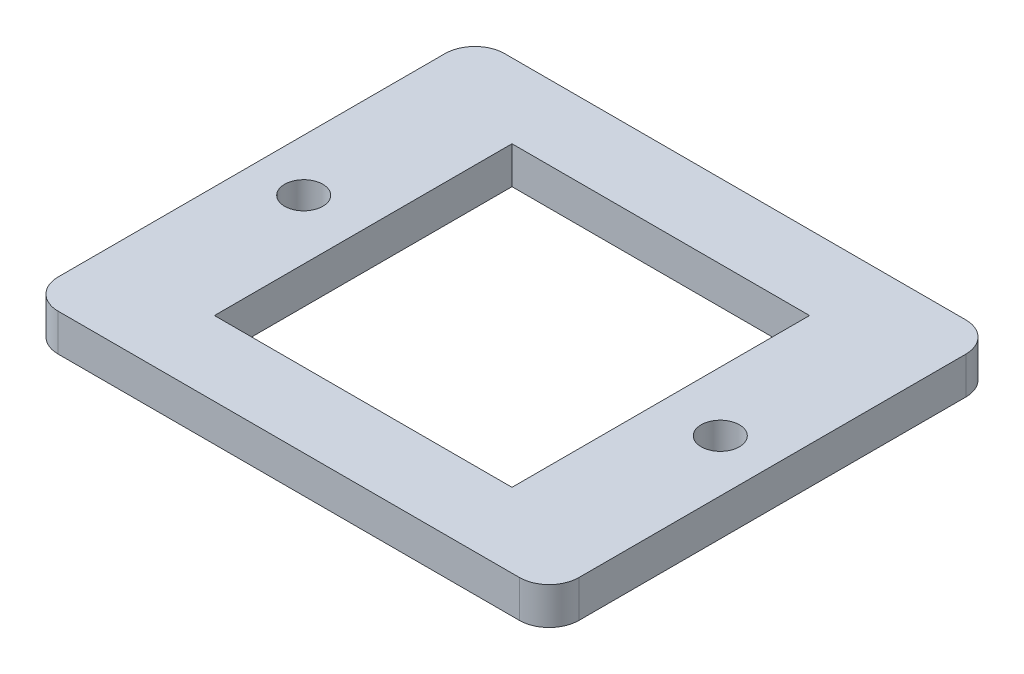
ISO-10303-21;
HEADER;
FILE_DESCRIPTION(('STEP AP214'),'2;1');
FILE_NAME('part.step','',(''),(''),'','','');
FILE_SCHEMA(('AUTOMOTIVE_DESIGN { 1 0 10303 214 1 1 1 1 }'));
ENDSEC;
DATA;
#1=APPLICATION_CONTEXT('core data for automotive mechanical design processes');
#2=APPLICATION_PROTOCOL_DEFINITION('international standard','automotive_design',2000,#1);
#3=PRODUCT_CONTEXT('',#1,'mechanical');
#4=PRODUCT('Part','Part','',(#3));
#5=PRODUCT_RELATED_PRODUCT_CATEGORY('part','',(#4));
#6=PRODUCT_DEFINITION_FORMATION('','',#4);
#7=PRODUCT_DEFINITION_CONTEXT('part definition',#1,'design');
#8=PRODUCT_DEFINITION('design','',#6,#7);
#9=PRODUCT_DEFINITION_SHAPE('','',#8);
#10=(LENGTH_UNIT() NAMED_UNIT(*) SI_UNIT(.MILLI.,.METRE.));
#11=(NAMED_UNIT(*) PLANE_ANGLE_UNIT() SI_UNIT($,.RADIAN.));
#12=(NAMED_UNIT(*) SI_UNIT($,.STERADIAN.) SOLID_ANGLE_UNIT());
#13=UNCERTAINTY_MEASURE_WITH_UNIT(LENGTH_MEASURE(1.E-05),#10,'distance_accuracy_value','');
#14=(GEOMETRIC_REPRESENTATION_CONTEXT(3) GLOBAL_UNCERTAINTY_ASSIGNED_CONTEXT((#13)) GLOBAL_UNIT_ASSIGNED_CONTEXT((#10,
#11,#12)) REPRESENTATION_CONTEXT('',''));
#15=CARTESIAN_POINT('',(0.,0.,0.));
#16=DIRECTION('',(0.,0.,1.));
#17=DIRECTION('',(1.,0.,0.));
#18=AXIS2_PLACEMENT_3D('',#15,#16,#17);
#19=CARTESIAN_POINT('',(22.225,3.175,-19.05));
#20=DIRECTION('',(-1.,0.,0.));
#21=DIRECTION('',(0.,0.,1.));
#22=AXIS2_PLACEMENT_3D('',#19,#20,#21);
#23=PLANE('',#22);
#24=DIRECTION('',(0.,0.,-1.));
#25=VECTOR('',#24,1.);
#26=CARTESIAN_POINT('',(22.225,3.175,-19.05));
#27=LINE('',#26,#25);
#28=CARTESIAN_POINT('',(22.225,3.175,16.51));
#29=VERTEX_POINT('',#28);
#30=CARTESIAN_POINT('',(22.225,3.175,-16.51));
#31=VERTEX_POINT('',#30);
#32=EDGE_CURVE('E171',#29,#31,#27,.T.);
#33=ORIENTED_EDGE('',*,*,#32,.F.);
#34=DIRECTION('',(0.,-1.,0.));
#35=VECTOR('',#34,1.);
#36=CARTESIAN_POINT('',(22.225,3.175,16.51));
#37=LINE('',#36,#35);
#38=CARTESIAN_POINT('',(22.225,0.,16.51));
#39=VERTEX_POINT('',#38);
#40=EDGE_CURVE('E199',#29,#39,#37,.T.);
#41=ORIENTED_EDGE('',*,*,#40,.T.);
#42=DIRECTION('',(0.,0.,-1.));
#43=VECTOR('',#42,1.);
#44=CARTESIAN_POINT('',(22.225,0.,-19.05));
#45=LINE('',#44,#43);
#46=CARTESIAN_POINT('',(22.225,0.,-16.51));
#47=VERTEX_POINT('',#46);
#48=EDGE_CURVE('E167',#39,#47,#45,.T.);
#49=ORIENTED_EDGE('',*,*,#48,.T.);
#50=DIRECTION('',(0.,-1.,0.));
#51=VECTOR('',#50,1.);
#52=CARTESIAN_POINT('',(22.225,3.175,-16.51));
#53=LINE('',#52,#51);
#54=EDGE_CURVE('E182',#47,#31,#53,.F.);
#55=ORIENTED_EDGE('',*,*,#54,.T.);
#56=EDGE_LOOP('',(#33,#41,#49,#55));
#57=FACE_BOUND('',#56,.T.);
#58=ADVANCED_FACE('F33',(#57),#23,.F.);
#59=CARTESIAN_POINT('',(-22.225,3.175,-19.05));
#60=DIRECTION('',(0.,0.,1.));
#61=DIRECTION('',(1.,0.,0.));
#62=AXIS2_PLACEMENT_3D('',#59,#60,#61);
#63=PLANE('',#62);
#64=DIRECTION('',(-1.,0.,0.));
#65=VECTOR('',#64,1.);
#66=CARTESIAN_POINT('',(-22.225,3.175,-19.05));
#67=LINE('',#66,#65);
#68=CARTESIAN_POINT('',(19.685,3.175,-19.05));
#69=VERTEX_POINT('',#68);
#70=CARTESIAN_POINT('',(-19.685,3.175,-19.05));
#71=VERTEX_POINT('',#70);
#72=EDGE_CURVE('E174',#69,#71,#67,.T.);
#73=ORIENTED_EDGE('',*,*,#72,.F.);
#74=DIRECTION('',(0.,-1.,0.));
#75=VECTOR('',#74,1.);
#76=CARTESIAN_POINT('',(19.685,3.175,-19.05));
#77=LINE('',#76,#75);
#78=CARTESIAN_POINT('',(19.685,0.,-19.05));
#79=VERTEX_POINT('',#78);
#80=EDGE_CURVE('E224',#69,#79,#77,.T.);
#81=ORIENTED_EDGE('',*,*,#80,.T.);
#82=DIRECTION('',(-1.,0.,0.));
#83=VECTOR('',#82,1.);
#84=CARTESIAN_POINT('',(-22.225,0.,-19.05));
#85=LINE('',#84,#83);
#86=CARTESIAN_POINT('',(-19.685,0.,-19.05));
#87=VERTEX_POINT('',#86);
#88=EDGE_CURVE('E185',#79,#87,#85,.T.);
#89=ORIENTED_EDGE('',*,*,#88,.T.);
#90=DIRECTION('',(0.,-1.,0.));
#91=VECTOR('',#90,1.);
#92=CARTESIAN_POINT('',(-19.685,3.175,-19.05));
#93=LINE('',#92,#91);
#94=EDGE_CURVE('E222',#87,#71,#93,.F.);
#95=ORIENTED_EDGE('',*,*,#94,.T.);
#96=EDGE_LOOP('',(#73,#81,#89,#95));
#97=FACE_BOUND('',#96,.T.);
#98=ADVANCED_FACE('F230',(#97),#63,.F.);
#99=CARTESIAN_POINT('',(-22.225,3.175,-19.05));
#100=DIRECTION('',(1.,0.,0.));
#101=DIRECTION('',(0.,0.,-1.));
#102=AXIS2_PLACEMENT_3D('',#99,#100,#101);
#103=PLANE('',#102);
#104=DIRECTION('',(0.,0.,1.));
#105=VECTOR('',#104,1.);
#106=CARTESIAN_POINT('',(-22.225,3.175,-19.05));
#107=LINE('',#106,#105);
#108=CARTESIAN_POINT('',(-22.225,3.175,-16.51));
#109=VERTEX_POINT('',#108);
#110=CARTESIAN_POINT('',(-22.225,3.175,16.51));
#111=VERTEX_POINT('',#110);
#112=EDGE_CURVE('E177',#109,#111,#107,.T.);
#113=ORIENTED_EDGE('',*,*,#112,.F.);
#114=DIRECTION('',(0.,-1.,0.));
#115=VECTOR('',#114,1.);
#116=CARTESIAN_POINT('',(-22.225,3.175,-16.51));
#117=LINE('',#116,#115);
#118=CARTESIAN_POINT('',(-22.225,0.,-16.51));
#119=VERTEX_POINT('',#118);
#120=EDGE_CURVE('E11',#109,#119,#117,.T.);
#121=ORIENTED_EDGE('',*,*,#120,.T.);
#122=DIRECTION('',(0.,0.,1.));
#123=VECTOR('',#122,1.);
#124=CARTESIAN_POINT('',(-22.225,0.,-19.05));
#125=LINE('',#124,#123);
#126=CARTESIAN_POINT('',(-22.225,0.,16.51));
#127=VERTEX_POINT('',#126);
#128=EDGE_CURVE('E188',#119,#127,#125,.T.);
#129=ORIENTED_EDGE('',*,*,#128,.T.);
#130=DIRECTION('',(0.,-1.,0.));
#131=VECTOR('',#130,1.);
#132=CARTESIAN_POINT('',(-22.225,3.175,16.51));
#133=LINE('',#132,#131);
#134=EDGE_CURVE('E41',#127,#111,#133,.F.);
#135=ORIENTED_EDGE('',*,*,#134,.T.);
#136=EDGE_LOOP('',(#113,#121,#129,#135));
#137=FACE_BOUND('',#136,.T.);
#138=ADVANCED_FACE('F239',(#137),#103,.F.);
#139=CARTESIAN_POINT('',(-22.225,3.175,19.05));
#140=DIRECTION('',(0.,0.,-1.));
#141=DIRECTION('',(-1.,0.,0.));
#142=AXIS2_PLACEMENT_3D('',#139,#140,#141);
#143=PLANE('',#142);
#144=DIRECTION('',(1.,0.,0.));
#145=VECTOR('',#144,1.);
#146=CARTESIAN_POINT('',(-22.225,0.,19.05));
#147=LINE('',#146,#145);
#148=CARTESIAN_POINT('',(-19.685,0.,19.05));
#149=VERTEX_POINT('',#148);
#150=CARTESIAN_POINT('',(19.685,0.,19.05));
#151=VERTEX_POINT('',#150);
#152=EDGE_CURVE('E175',#149,#151,#147,.T.);
#153=ORIENTED_EDGE('',*,*,#152,.T.);
#154=DIRECTION('',(0.,-1.,0.));
#155=VECTOR('',#154,1.);
#156=CARTESIAN_POINT('',(19.685,3.175,19.05));
#157=LINE('',#156,#155);
#158=CARTESIAN_POINT('',(19.685,3.175,19.05));
#159=VERTEX_POINT('',#158);
#160=EDGE_CURVE('E213',#151,#159,#157,.F.);
#161=ORIENTED_EDGE('',*,*,#160,.T.);
#162=DIRECTION('',(1.,0.,0.));
#163=VECTOR('',#162,1.);
#164=CARTESIAN_POINT('',(-22.225,3.175,19.05));
#165=LINE('',#164,#163);
#166=CARTESIAN_POINT('',(-19.685,3.175,19.05));
#167=VERTEX_POINT('',#166);
#168=EDGE_CURVE('E179',#167,#159,#165,.T.);
#169=ORIENTED_EDGE('',*,*,#168,.F.);
#170=DIRECTION('',(0.,-1.,0.));
#171=VECTOR('',#170,1.);
#172=CARTESIAN_POINT('',(-19.685,3.175,19.05));
#173=LINE('',#172,#171);
#174=EDGE_CURVE('E210',#167,#149,#173,.T.);
#175=ORIENTED_EDGE('',*,*,#174,.T.);
#176=EDGE_LOOP('',(#153,#161,#169,#175));
#177=FACE_BOUND('',#176,.T.);
#178=ADVANCED_FACE('F247',(#177),#143,.F.);
#179=CARTESIAN_POINT('',(0.,3.175,0.));
#180=DIRECTION('',(0.,1.,0.));
#181=DIRECTION('',(0.,0.,1.));
#182=AXIS2_PLACEMENT_3D('',#179,#180,#181);
#183=PLANE('',#182);
#184=CARTESIAN_POINT('',(-17.78,3.175,0.));
#185=DIRECTION('',(0.,1.,0.));
#186=DIRECTION('',(0.,0.,1.));
#187=AXIS2_PLACEMENT_3D('',#184,#185,#186);
#188=CIRCLE('',#187,1.63194999999999);
#189=CARTESIAN_POINT('',(-17.78,3.175,1.63194999999999));
#190=VERTEX_POINT('',#189);
#191=EDGE_CURVE('E197',#190,#190,#188,.T.);
#192=ORIENTED_EDGE('',*,*,#191,.F.);
#193=EDGE_LOOP('',(#192));
#194=FACE_BOUND('',#193,.T.);
#195=CARTESIAN_POINT('',(17.78,3.175,0.));
#196=DIRECTION('',(0.,1.,0.));
#197=DIRECTION('',(0.,0.,1.));
#198=AXIS2_PLACEMENT_3D('',#195,#196,#197);
#199=CIRCLE('',#198,1.63194999999999);
#200=CARTESIAN_POINT('',(17.78,3.175,1.63194999999999));
#201=VERTEX_POINT('',#200);
#202=EDGE_CURVE('E154',#201,#201,#199,.T.);
#203=ORIENTED_EDGE('',*,*,#202,.F.);
#204=EDGE_LOOP('',(#203));
#205=FACE_BOUND('',#204,.T.);
#206=DIRECTION('',(0.,0.,-1.));
#207=VECTOR('',#206,1.);
#208=CARTESIAN_POINT('',(12.7,3.175,-12.7));
#209=LINE('',#208,#207);
#210=CARTESIAN_POINT('',(12.7,3.175,12.7));
#211=VERTEX_POINT('',#210);
#212=CARTESIAN_POINT('',(12.7,3.175,-12.7));
#213=VERTEX_POINT('',#212);
#214=EDGE_CURVE('E130',#211,#213,#209,.T.);
#215=ORIENTED_EDGE('',*,*,#214,.F.);
#216=DIRECTION('',(1.,0.,0.));
#217=VECTOR('',#216,1.);
#218=CARTESIAN_POINT('',(-12.7,3.175,12.7));
#219=LINE('',#218,#217);
#220=CARTESIAN_POINT('',(-12.7,3.175,12.7));
#221=VERTEX_POINT('',#220);
#222=EDGE_CURVE('E148',#221,#211,#219,.T.);
#223=ORIENTED_EDGE('',*,*,#222,.F.);
#224=DIRECTION('',(0.,0.,1.));
#225=VECTOR('',#224,1.);
#226=CARTESIAN_POINT('',(-12.7,3.175,-12.7));
#227=LINE('',#226,#225);
#228=CARTESIAN_POINT('',(-12.7,3.175,-12.7));
#229=VERTEX_POINT('',#228);
#230=EDGE_CURVE('E151',#229,#221,#227,.T.);
#231=ORIENTED_EDGE('',*,*,#230,.F.);
#232=DIRECTION('',(-1.,0.,0.));
#233=VECTOR('',#232,1.);
#234=CARTESIAN_POINT('',(-12.7,3.175,-12.7));
#235=LINE('',#234,#233);
#236=EDGE_CURVE('E160',#213,#229,#235,.T.);
#237=ORIENTED_EDGE('',*,*,#236,.F.);
#238=EDGE_LOOP('',(#215,#223,#231,#237));
#239=FACE_BOUND('',#238,.T.);
#240=ORIENTED_EDGE('',*,*,#168,.T.);
#241=CARTESIAN_POINT('',(19.685,3.175,16.51));
#242=DIRECTION('',(0.,1.,0.));
#243=DIRECTION('',(0.,0.,1.));
#244=AXIS2_PLACEMENT_3D('',#241,#242,#243);
#245=CIRCLE('',#244,2.54);
#246=EDGE_CURVE('E220',#159,#29,#245,.T.);
#247=ORIENTED_EDGE('',*,*,#246,.T.);
#248=ORIENTED_EDGE('',*,*,#32,.T.);
#249=CARTESIAN_POINT('',(19.685,3.175,-16.51));
#250=DIRECTION('',(0.,1.,0.));
#251=DIRECTION('',(0.,0.,1.));
#252=AXIS2_PLACEMENT_3D('',#249,#250,#251);
#253=CIRCLE('',#252,2.54);
#254=EDGE_CURVE('E218',#31,#69,#253,.T.);
#255=ORIENTED_EDGE('',*,*,#254,.T.);
#256=ORIENTED_EDGE('',*,*,#72,.T.);
#257=CARTESIAN_POINT('',(-19.685,3.175,-16.51));
#258=DIRECTION('',(0.,1.,0.));
#259=DIRECTION('',(0.,0.,1.));
#260=AXIS2_PLACEMENT_3D('',#257,#258,#259);
#261=CIRCLE('',#260,2.54);
#262=EDGE_CURVE('E54',#71,#109,#261,.T.);
#263=ORIENTED_EDGE('',*,*,#262,.T.);
#264=ORIENTED_EDGE('',*,*,#112,.T.);
#265=CARTESIAN_POINT('',(-19.685,3.175,16.51));
#266=DIRECTION('',(0.,1.,0.));
#267=DIRECTION('',(0.,0.,1.));
#268=AXIS2_PLACEMENT_3D('',#265,#266,#267);
#269=CIRCLE('',#268,2.54);
#270=EDGE_CURVE('E215',#111,#167,#269,.T.);
#271=ORIENTED_EDGE('',*,*,#270,.T.);
#272=EDGE_LOOP('',(#240,#247,#248,#255,#256,#263,#264,#271));
#273=FACE_BOUND('',#272,.T.);
#274=ADVANCED_FACE('F241',(#194,#205,#239,#273),#183,.T.);
#275=CARTESIAN_POINT('',(0.,0.,0.));
#276=DIRECTION('',(0.,1.,0.));
#277=DIRECTION('',(0.,0.,1.));
#278=AXIS2_PLACEMENT_3D('',#275,#276,#277);
#279=PLANE('',#278);
#280=CARTESIAN_POINT('',(-17.78,0.,0.));
#281=DIRECTION('',(0.,1.,0.));
#282=DIRECTION('',(0.,0.,1.));
#283=AXIS2_PLACEMENT_3D('',#280,#281,#282);
#284=CIRCLE('',#283,1.63194999999999);
#285=CARTESIAN_POINT('',(-17.78,0.,1.63194999999999));
#286=VERTEX_POINT('',#285);
#287=EDGE_CURVE('E194',#286,#286,#284,.T.);
#288=ORIENTED_EDGE('',*,*,#287,.T.);
#289=EDGE_LOOP('',(#288));
#290=FACE_BOUND('',#289,.T.);
#291=CARTESIAN_POINT('',(17.78,0.,0.));
#292=DIRECTION('',(0.,1.,0.));
#293=DIRECTION('',(0.,0.,1.));
#294=AXIS2_PLACEMENT_3D('',#291,#292,#293);
#295=CIRCLE('',#294,1.63194999999999);
#296=CARTESIAN_POINT('',(17.78,0.,1.63194999999999));
#297=VERTEX_POINT('',#296);
#298=EDGE_CURVE('E161',#297,#297,#295,.T.);
#299=ORIENTED_EDGE('',*,*,#298,.T.);
#300=EDGE_LOOP('',(#299));
#301=FACE_BOUND('',#300,.T.);
#302=DIRECTION('',(1.,0.,0.));
#303=VECTOR('',#302,1.);
#304=CARTESIAN_POINT('',(-12.7,0.,12.7));
#305=LINE('',#304,#303);
#306=CARTESIAN_POINT('',(-12.7,0.,12.7));
#307=VERTEX_POINT('',#306);
#308=CARTESIAN_POINT('',(12.7,0.,12.7));
#309=VERTEX_POINT('',#308);
#310=EDGE_CURVE('E135',#307,#309,#305,.T.);
#311=ORIENTED_EDGE('',*,*,#310,.T.);
#312=DIRECTION('',(0.,0.,-1.));
#313=VECTOR('',#312,1.);
#314=CARTESIAN_POINT('',(12.7,0.,-12.7));
#315=LINE('',#314,#313);
#316=CARTESIAN_POINT('',(12.7,0.,-12.7));
#317=VERTEX_POINT('',#316);
#318=EDGE_CURVE('E127',#309,#317,#315,.T.);
#319=ORIENTED_EDGE('',*,*,#318,.T.);
#320=DIRECTION('',(-1.,0.,0.));
#321=VECTOR('',#320,1.);
#322=CARTESIAN_POINT('',(-12.7,0.,-12.7));
#323=LINE('',#322,#321);
#324=CARTESIAN_POINT('',(-12.7,0.,-12.7));
#325=VERTEX_POINT('',#324);
#326=EDGE_CURVE('E139',#317,#325,#323,.T.);
#327=ORIENTED_EDGE('',*,*,#326,.T.);
#328=DIRECTION('',(0.,0.,1.));
#329=VECTOR('',#328,1.);
#330=CARTESIAN_POINT('',(-12.7,0.,-12.7));
#331=LINE('',#330,#329);
#332=EDGE_CURVE('E143',#325,#307,#331,.T.);
#333=ORIENTED_EDGE('',*,*,#332,.T.);
#334=EDGE_LOOP('',(#311,#319,#327,#333));
#335=FACE_BOUND('',#334,.T.);
#336=ORIENTED_EDGE('',*,*,#48,.F.);
#337=CARTESIAN_POINT('',(19.685,0.,16.51));
#338=DIRECTION('',(0.,1.,0.));
#339=DIRECTION('',(0.,0.,1.));
#340=AXIS2_PLACEMENT_3D('',#337,#338,#339);
#341=CIRCLE('',#340,2.54);
#342=EDGE_CURVE('E208',#39,#151,#341,.F.);
#343=ORIENTED_EDGE('',*,*,#342,.T.);
#344=ORIENTED_EDGE('',*,*,#152,.F.);
#345=CARTESIAN_POINT('',(-19.685,0.,16.51));
#346=DIRECTION('',(0.,1.,0.));
#347=DIRECTION('',(0.,0.,1.));
#348=AXIS2_PLACEMENT_3D('',#345,#346,#347);
#349=CIRCLE('',#348,2.54);
#350=EDGE_CURVE('E202',#149,#127,#349,.F.);
#351=ORIENTED_EDGE('',*,*,#350,.T.);
#352=ORIENTED_EDGE('',*,*,#128,.F.);
#353=CARTESIAN_POINT('',(-19.685,0.,-16.51));
#354=DIRECTION('',(0.,1.,0.));
#355=DIRECTION('',(0.,0.,1.));
#356=AXIS2_PLACEMENT_3D('',#353,#354,#355);
#357=CIRCLE('',#356,2.54);
#358=EDGE_CURVE('E204',#119,#87,#357,.F.);
#359=ORIENTED_EDGE('',*,*,#358,.T.);
#360=ORIENTED_EDGE('',*,*,#88,.F.);
#361=CARTESIAN_POINT('',(19.685,0.,-16.51));
#362=DIRECTION('',(0.,1.,0.));
#363=DIRECTION('',(0.,0.,1.));
#364=AXIS2_PLACEMENT_3D('',#361,#362,#363);
#365=CIRCLE('',#364,2.54);
#366=EDGE_CURVE('E206',#79,#47,#365,.F.);
#367=ORIENTED_EDGE('',*,*,#366,.T.);
#368=EDGE_LOOP('',(#336,#343,#344,#351,#352,#359,#360,#367));
#369=FACE_BOUND('',#368,.T.);
#370=ADVANCED_FACE('F145',(#290,#301,#335,#369),#279,.F.);
#371=CARTESIAN_POINT('',(12.7,0.,-12.7));
#372=DIRECTION('',(1.,0.,0.));
#373=DIRECTION('',(0.,0.,-1.));
#374=AXIS2_PLACEMENT_3D('',#371,#372,#373);
#375=PLANE('',#374);
#376=ORIENTED_EDGE('',*,*,#214,.T.);
#377=DIRECTION('',(0.,1.,0.));
#378=VECTOR('',#377,1.);
#379=CARTESIAN_POINT('',(12.7,0.,-12.7));
#380=LINE('',#379,#378);
#381=EDGE_CURVE('E123',#317,#213,#380,.T.);
#382=ORIENTED_EDGE('',*,*,#381,.F.);
#383=ORIENTED_EDGE('',*,*,#318,.F.);
#384=DIRECTION('',(0.,1.,0.));
#385=VECTOR('',#384,1.);
#386=CARTESIAN_POINT('',(12.7,0.,12.7));
#387=LINE('',#386,#385);
#388=EDGE_CURVE('E165',#309,#211,#387,.T.);
#389=ORIENTED_EDGE('',*,*,#388,.T.);
#390=EDGE_LOOP('',(#376,#382,#383,#389));
#391=FACE_BOUND('',#390,.T.);
#392=ADVANCED_FACE('F125',(#391),#375,.F.);
#393=CARTESIAN_POINT('',(-12.7,0.,12.7));
#394=DIRECTION('',(0.,0.,1.));
#395=DIRECTION('',(1.,0.,0.));
#396=AXIS2_PLACEMENT_3D('',#393,#394,#395);
#397=PLANE('',#396);
#398=ORIENTED_EDGE('',*,*,#222,.T.);
#399=ORIENTED_EDGE('',*,*,#388,.F.);
#400=ORIENTED_EDGE('',*,*,#310,.F.);
#401=DIRECTION('',(0.,1.,0.));
#402=VECTOR('',#401,1.);
#403=CARTESIAN_POINT('',(-12.7,0.,12.7));
#404=LINE('',#403,#402);
#405=EDGE_CURVE('E168',#307,#221,#404,.T.);
#406=ORIENTED_EDGE('',*,*,#405,.T.);
#407=EDGE_LOOP('',(#398,#399,#400,#406));
#408=FACE_BOUND('',#407,.T.);
#409=ADVANCED_FACE('F284',(#408),#397,.F.);
#410=CARTESIAN_POINT('',(-12.7,0.,-12.7));
#411=DIRECTION('',(-1.,0.,0.));
#412=DIRECTION('',(0.,0.,1.));
#413=AXIS2_PLACEMENT_3D('',#410,#411,#412);
#414=PLANE('',#413);
#415=ORIENTED_EDGE('',*,*,#230,.T.);
#416=ORIENTED_EDGE('',*,*,#405,.F.);
#417=ORIENTED_EDGE('',*,*,#332,.F.);
#418=DIRECTION('',(0.,1.,0.));
#419=VECTOR('',#418,1.);
#420=CARTESIAN_POINT('',(-12.7,0.,-12.7));
#421=LINE('',#420,#419);
#422=EDGE_CURVE('E134',#325,#229,#421,.T.);
#423=ORIENTED_EDGE('',*,*,#422,.T.);
#424=EDGE_LOOP('',(#415,#416,#417,#423));
#425=FACE_BOUND('',#424,.T.);
#426=ADVANCED_FACE('F288',(#425),#414,.F.);
#427=CARTESIAN_POINT('',(-12.7,0.,-12.7));
#428=DIRECTION('',(0.,0.,-1.));
#429=DIRECTION('',(-1.,0.,0.));
#430=AXIS2_PLACEMENT_3D('',#427,#428,#429);
#431=PLANE('',#430);
#432=ORIENTED_EDGE('',*,*,#236,.T.);
#433=ORIENTED_EDGE('',*,*,#422,.F.);
#434=ORIENTED_EDGE('',*,*,#326,.F.);
#435=ORIENTED_EDGE('',*,*,#381,.T.);
#436=EDGE_LOOP('',(#432,#433,#434,#435));
#437=FACE_BOUND('',#436,.T.);
#438=ADVANCED_FACE('F140',(#437),#431,.F.);
#439=CARTESIAN_POINT('',(17.78,3.175,0.));
#440=DIRECTION('',(0.,1.,0.));
#441=DIRECTION('',(0.,0.,1.));
#442=AXIS2_PLACEMENT_3D('',#439,#440,#441);
#443=CYLINDRICAL_SURFACE('',#442,1.63194999999999);
#444=ORIENTED_EDGE('',*,*,#202,.T.);
#445=EDGE_LOOP('',(#444));
#446=FACE_BOUND('',#445,.T.);
#447=ORIENTED_EDGE('',*,*,#298,.F.);
#448=EDGE_LOOP('',(#447));
#449=FACE_BOUND('',#448,.T.);
#450=ADVANCED_FACE('F287',(#446,#449),#443,.F.);
#451=CARTESIAN_POINT('',(-17.78,3.175,0.));
#452=DIRECTION('',(0.,1.,0.));
#453=DIRECTION('',(0.,0.,1.));
#454=AXIS2_PLACEMENT_3D('',#451,#452,#453);
#455=CYLINDRICAL_SURFACE('',#454,1.63194999999999);
#456=ORIENTED_EDGE('',*,*,#191,.T.);
#457=EDGE_LOOP('',(#456));
#458=FACE_BOUND('',#457,.T.);
#459=ORIENTED_EDGE('',*,*,#287,.F.);
#460=EDGE_LOOP('',(#459));
#461=FACE_BOUND('',#460,.T.);
#462=ADVANCED_FACE('F263',(#458,#461),#455,.F.);
#463=CARTESIAN_POINT('',(19.685,3.175,16.51));
#464=DIRECTION('',(0.,-1.,0.));
#465=DIRECTION('',(0.,0.,-1.));
#466=AXIS2_PLACEMENT_3D('',#463,#464,#465);
#467=CYLINDRICAL_SURFACE('',#466,2.54);
#468=ORIENTED_EDGE('',*,*,#246,.F.);
#469=ORIENTED_EDGE('',*,*,#160,.F.);
#470=ORIENTED_EDGE('',*,*,#342,.F.);
#471=ORIENTED_EDGE('',*,*,#40,.F.);
#472=EDGE_LOOP('',(#468,#469,#470,#471));
#473=FACE_BOUND('',#472,.T.);
#474=ADVANCED_FACE('F252',(#473),#467,.T.);
#475=CARTESIAN_POINT('',(19.685,3.175,-16.51));
#476=DIRECTION('',(0.,-1.,0.));
#477=DIRECTION('',(0.,0.,-1.));
#478=AXIS2_PLACEMENT_3D('',#475,#476,#477);
#479=CYLINDRICAL_SURFACE('',#478,2.54);
#480=ORIENTED_EDGE('',*,*,#254,.F.);
#481=ORIENTED_EDGE('',*,*,#54,.F.);
#482=ORIENTED_EDGE('',*,*,#366,.F.);
#483=ORIENTED_EDGE('',*,*,#80,.F.);
#484=EDGE_LOOP('',(#480,#481,#482,#483));
#485=FACE_BOUND('',#484,.T.);
#486=ADVANCED_FACE('F256',(#485),#479,.T.);
#487=CARTESIAN_POINT('',(-19.685,3.175,-16.51));
#488=DIRECTION('',(0.,-1.,0.));
#489=DIRECTION('',(0.,0.,-1.));
#490=AXIS2_PLACEMENT_3D('',#487,#488,#489);
#491=CYLINDRICAL_SURFACE('',#490,2.54);
#492=ORIENTED_EDGE('',*,*,#262,.F.);
#493=ORIENTED_EDGE('',*,*,#94,.F.);
#494=ORIENTED_EDGE('',*,*,#358,.F.);
#495=ORIENTED_EDGE('',*,*,#120,.F.);
#496=EDGE_LOOP('',(#492,#493,#494,#495));
#497=FACE_BOUND('',#496,.T.);
#498=ADVANCED_FACE('F238',(#497),#491,.T.);
#499=CARTESIAN_POINT('',(-19.685,3.175,16.51));
#500=DIRECTION('',(0.,-1.,0.));
#501=DIRECTION('',(0.,0.,-1.));
#502=AXIS2_PLACEMENT_3D('',#499,#500,#501);
#503=CYLINDRICAL_SURFACE('',#502,2.54);
#504=ORIENTED_EDGE('',*,*,#270,.F.);
#505=ORIENTED_EDGE('',*,*,#134,.F.);
#506=ORIENTED_EDGE('',*,*,#350,.F.);
#507=ORIENTED_EDGE('',*,*,#174,.F.);
#508=EDGE_LOOP('',(#504,#505,#506,#507));
#509=FACE_BOUND('',#508,.T.);
#510=ADVANCED_FACE('F35',(#509),#503,.T.);
#511=CLOSED_SHELL('',(#58,#98,#138,#178,#274,#370,#392,#409,#426,#438,#450,#462,#474,#486,#498,#510));
#512=MANIFOLD_SOLID_BREP('B2',#511);
#513=ADVANCED_BREP_SHAPE_REPRESENTATION('',(#18,#512),#14);
#514=SHAPE_DEFINITION_REPRESENTATION(#9,#513);
ENDSEC;
END-ISO-10303-21;
